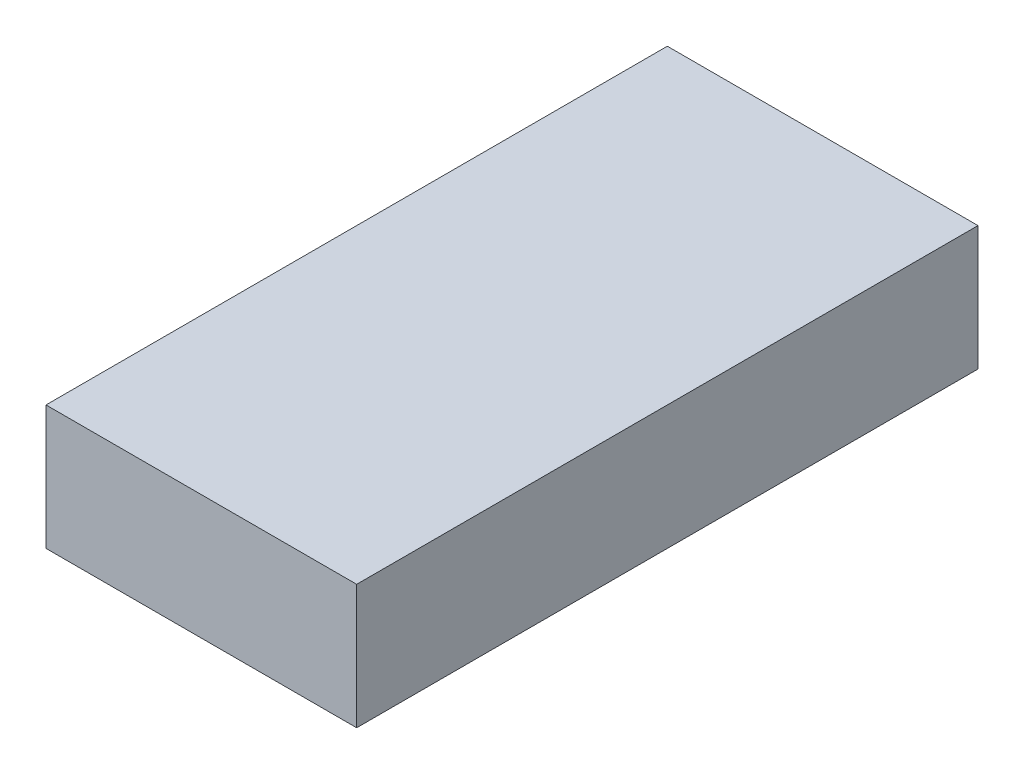
ISO-10303-21;
HEADER;
FILE_DESCRIPTION(('STEP AP214'),'2;1');
FILE_NAME('part.step','',(''),(''),'','','');
FILE_SCHEMA(('AUTOMOTIVE_DESIGN { 1 0 10303 214 1 1 1 1 }'));
ENDSEC;
DATA;
#1=APPLICATION_CONTEXT('core data for automotive mechanical design processes');
#2=APPLICATION_PROTOCOL_DEFINITION('international standard','automotive_design',2000,#1);
#3=PRODUCT_CONTEXT('',#1,'mechanical');
#4=PRODUCT('Part','Part','',(#3));
#5=PRODUCT_RELATED_PRODUCT_CATEGORY('part','',(#4));
#6=PRODUCT_DEFINITION_FORMATION('','',#4);
#7=PRODUCT_DEFINITION_CONTEXT('part definition',#1,'design');
#8=PRODUCT_DEFINITION('design','',#6,#7);
#9=PRODUCT_DEFINITION_SHAPE('','',#8);
#10=(LENGTH_UNIT() NAMED_UNIT(*) SI_UNIT(.MILLI.,.METRE.));
#11=(NAMED_UNIT(*) PLANE_ANGLE_UNIT() SI_UNIT($,.RADIAN.));
#12=(NAMED_UNIT(*) SI_UNIT($,.STERADIAN.) SOLID_ANGLE_UNIT());
#13=UNCERTAINTY_MEASURE_WITH_UNIT(LENGTH_MEASURE(1.E-05),#10,'distance_accuracy_value','');
#14=(GEOMETRIC_REPRESENTATION_CONTEXT(3) GLOBAL_UNCERTAINTY_ASSIGNED_CONTEXT((#13)) GLOBAL_UNIT_ASSIGNED_CONTEXT((#10,
#11,#12)) REPRESENTATION_CONTEXT('',''));
#15=CARTESIAN_POINT('',(0.,0.,0.));
#16=DIRECTION('',(0.,0.,1.));
#17=DIRECTION('',(1.,0.,0.));
#18=AXIS2_PLACEMENT_3D('',#15,#16,#17);
#19=CARTESIAN_POINT('',(25.,20.,50.));
#20=DIRECTION('',(-1.,0.,0.));
#21=DIRECTION('',(0.,0.,1.));
#22=AXIS2_PLACEMENT_3D('',#19,#20,#21);
#23=PLANE('',#22);
#24=DIRECTION('',(0.,0.,-1.));
#25=VECTOR('',#24,1.);
#26=CARTESIAN_POINT('',(25.,0.,50.));
#27=LINE('',#26,#25);
#28=CARTESIAN_POINT('',(25.,0.,50.));
#29=VERTEX_POINT('',#28);
#30=CARTESIAN_POINT('',(25.,0.,-50.));
#31=VERTEX_POINT('',#30);
#32=EDGE_CURVE('E100',#29,#31,#27,.T.);
#33=ORIENTED_EDGE('',*,*,#32,.T.);
#34=DIRECTION('',(0.,-1.,0.));
#35=VECTOR('',#34,1.);
#36=CARTESIAN_POINT('',(25.,20.,-50.));
#37=LINE('',#36,#35);
#38=CARTESIAN_POINT('',(25.,20.,-50.));
#39=VERTEX_POINT('',#38);
#40=EDGE_CURVE('E11',#39,#31,#37,.T.);
#41=ORIENTED_EDGE('',*,*,#40,.F.);
#42=DIRECTION('',(0.,0.,-1.));
#43=VECTOR('',#42,1.);
#44=CARTESIAN_POINT('',(25.,20.,50.));
#45=LINE('',#44,#43);
#46=CARTESIAN_POINT('',(25.,20.,50.));
#47=VERTEX_POINT('',#46);
#48=EDGE_CURVE('E88',#47,#39,#45,.T.);
#49=ORIENTED_EDGE('',*,*,#48,.F.);
#50=DIRECTION('',(0.,-1.,0.));
#51=VECTOR('',#50,1.);
#52=CARTESIAN_POINT('',(25.,20.,50.));
#53=LINE('',#52,#51);
#54=EDGE_CURVE('E96',#47,#29,#53,.T.);
#55=ORIENTED_EDGE('',*,*,#54,.T.);
#56=EDGE_LOOP('',(#33,#41,#49,#55));
#57=FACE_BOUND('',#56,.T.);
#58=ADVANCED_FACE('F37',(#57),#23,.F.);
#59=CARTESIAN_POINT('',(-25.,20.,-50.));
#60=DIRECTION('',(0.,0.,1.));
#61=DIRECTION('',(1.,0.,0.));
#62=AXIS2_PLACEMENT_3D('',#59,#60,#61);
#63=PLANE('',#62);
#64=DIRECTION('',(-1.,0.,0.));
#65=VECTOR('',#64,1.);
#66=CARTESIAN_POINT('',(-25.,0.,-50.));
#67=LINE('',#66,#65);
#68=CARTESIAN_POINT('',(-25.,0.,-50.));
#69=VERTEX_POINT('',#68);
#70=EDGE_CURVE('E92',#31,#69,#67,.T.);
#71=ORIENTED_EDGE('',*,*,#70,.T.);
#72=DIRECTION('',(0.,-1.,0.));
#73=VECTOR('',#72,1.);
#74=CARTESIAN_POINT('',(-25.,20.,-50.));
#75=LINE('',#74,#73);
#76=CARTESIAN_POINT('',(-25.,20.,-50.));
#77=VERTEX_POINT('',#76);
#78=EDGE_CURVE('E45',#77,#69,#75,.T.);
#79=ORIENTED_EDGE('',*,*,#78,.F.);
#80=DIRECTION('',(-1.,0.,0.));
#81=VECTOR('',#80,1.);
#82=CARTESIAN_POINT('',(-25.,20.,-50.));
#83=LINE('',#82,#81);
#84=EDGE_CURVE('E83',#39,#77,#83,.T.);
#85=ORIENTED_EDGE('',*,*,#84,.F.);
#86=ORIENTED_EDGE('',*,*,#40,.T.);
#87=EDGE_LOOP('',(#71,#79,#85,#86));
#88=FACE_BOUND('',#87,.T.);
#89=ADVANCED_FACE('F91',(#88),#63,.F.);
#90=CARTESIAN_POINT('',(-25.,20.,50.));
#91=DIRECTION('',(1.,0.,0.));
#92=DIRECTION('',(0.,0.,-1.));
#93=AXIS2_PLACEMENT_3D('',#90,#91,#92);
#94=PLANE('',#93);
#95=DIRECTION('',(0.,0.,1.));
#96=VECTOR('',#95,1.);
#97=CARTESIAN_POINT('',(-25.,0.,50.));
#98=LINE('',#97,#96);
#99=CARTESIAN_POINT('',(-25.,0.,50.));
#100=VERTEX_POINT('',#99);
#101=EDGE_CURVE('E70',#69,#100,#98,.T.);
#102=ORIENTED_EDGE('',*,*,#101,.T.);
#103=DIRECTION('',(0.,-1.,0.));
#104=VECTOR('',#103,1.);
#105=CARTESIAN_POINT('',(-25.,20.,50.));
#106=LINE('',#105,#104);
#107=CARTESIAN_POINT('',(-25.,20.,50.));
#108=VERTEX_POINT('',#107);
#109=EDGE_CURVE('E93',#108,#100,#106,.T.);
#110=ORIENTED_EDGE('',*,*,#109,.F.);
#111=DIRECTION('',(0.,0.,1.));
#112=VECTOR('',#111,1.);
#113=CARTESIAN_POINT('',(-25.,20.,50.));
#114=LINE('',#113,#112);
#115=EDGE_CURVE('E86',#77,#108,#114,.T.);
#116=ORIENTED_EDGE('',*,*,#115,.F.);
#117=ORIENTED_EDGE('',*,*,#78,.T.);
#118=EDGE_LOOP('',(#102,#110,#116,#117));
#119=FACE_BOUND('',#118,.T.);
#120=ADVANCED_FACE('F94',(#119),#94,.F.);
#121=CARTESIAN_POINT('',(-25.,20.,50.));
#122=DIRECTION('',(0.,0.,-1.));
#123=DIRECTION('',(-1.,0.,0.));
#124=AXIS2_PLACEMENT_3D('',#121,#122,#123);
#125=PLANE('',#124);
#126=DIRECTION('',(1.,0.,0.));
#127=VECTOR('',#126,1.);
#128=CARTESIAN_POINT('',(-25.,0.,50.));
#129=LINE('',#128,#127);
#130=EDGE_CURVE('E76',#100,#29,#129,.T.);
#131=ORIENTED_EDGE('',*,*,#130,.T.);
#132=ORIENTED_EDGE('',*,*,#54,.F.);
#133=DIRECTION('',(1.,0.,0.));
#134=VECTOR('',#133,1.);
#135=CARTESIAN_POINT('',(-25.,20.,50.));
#136=LINE('',#135,#134);
#137=EDGE_CURVE('E53',#108,#47,#136,.T.);
#138=ORIENTED_EDGE('',*,*,#137,.F.);
#139=ORIENTED_EDGE('',*,*,#109,.T.);
#140=EDGE_LOOP('',(#131,#132,#138,#139));
#141=FACE_BOUND('',#140,.T.);
#142=ADVANCED_FACE('F107',(#141),#125,.F.);
#143=CARTESIAN_POINT('',(0.,20.,0.));
#144=DIRECTION('',(0.,-1.,0.));
#145=DIRECTION('',(0.,0.,-1.));
#146=AXIS2_PLACEMENT_3D('',#143,#144,#145);
#147=PLANE('',#146);
#148=ORIENTED_EDGE('',*,*,#48,.T.);
#149=ORIENTED_EDGE('',*,*,#84,.T.);
#150=ORIENTED_EDGE('',*,*,#115,.T.);
#151=ORIENTED_EDGE('',*,*,#137,.T.);
#152=EDGE_LOOP('',(#148,#149,#150,#151));
#153=FACE_BOUND('',#152,.T.);
#154=ADVANCED_FACE('F84',(#153),#147,.F.);
#155=CARTESIAN_POINT('',(0.,0.,0.));
#156=DIRECTION('',(0.,-1.,0.));
#157=DIRECTION('',(0.,0.,-1.));
#158=AXIS2_PLACEMENT_3D('',#155,#156,#157);
#159=PLANE('',#158);
#160=ORIENTED_EDGE('',*,*,#32,.F.);
#161=ORIENTED_EDGE('',*,*,#130,.F.);
#162=ORIENTED_EDGE('',*,*,#101,.F.);
#163=ORIENTED_EDGE('',*,*,#70,.F.);
#164=EDGE_LOOP('',(#160,#161,#162,#163));
#165=FACE_BOUND('',#164,.T.);
#166=ADVANCED_FACE('F110',(#165),#159,.T.);
#167=CLOSED_SHELL('',(#58,#89,#120,#142,#154,#166));
#168=MANIFOLD_SOLID_BREP('B2',#167);
#169=ADVANCED_BREP_SHAPE_REPRESENTATION('',(#18,#168),#14);
#170=SHAPE_DEFINITION_REPRESENTATION(#9,#169);
ENDSEC;
END-ISO-10303-21;
